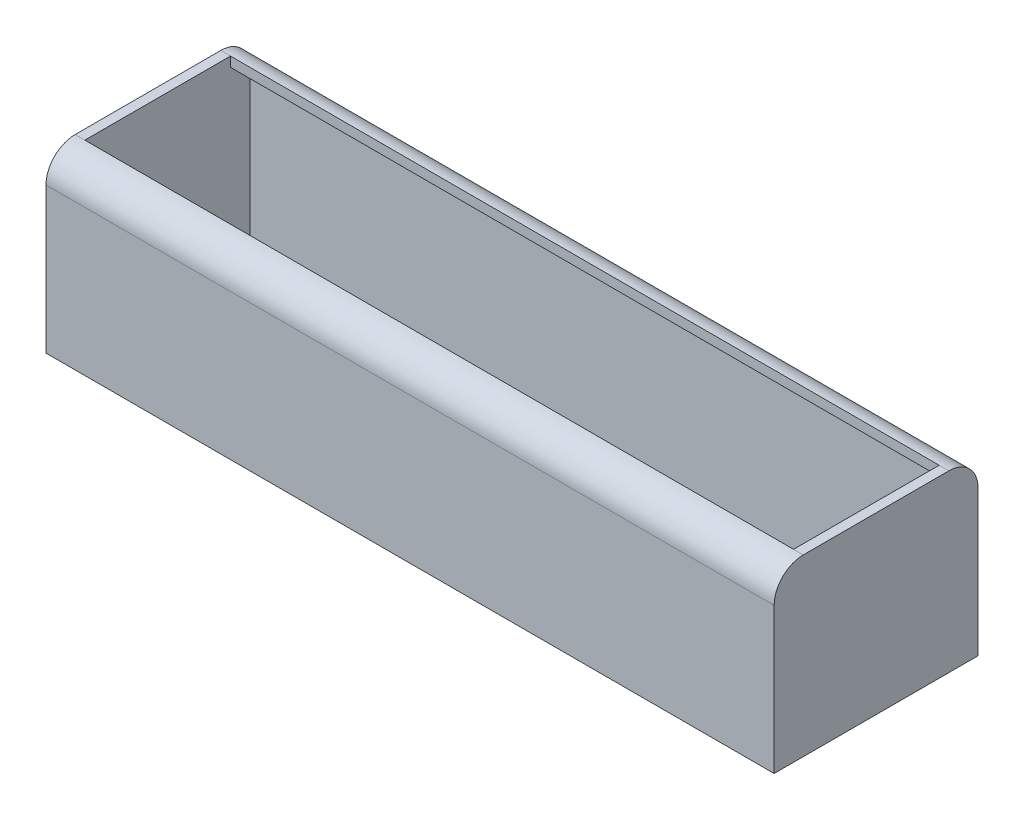
ISO-10303-21;
HEADER;
FILE_DESCRIPTION(('STEP AP214'),'2;1');
FILE_NAME('part.step','',(''),(''),'','','');
FILE_SCHEMA(('AUTOMOTIVE_DESIGN { 1 0 10303 214 1 1 1 1 }'));
ENDSEC;
DATA;
#1=APPLICATION_CONTEXT('core data for automotive mechanical design processes');
#2=APPLICATION_PROTOCOL_DEFINITION('international standard','automotive_design',2000,#1);
#3=PRODUCT_CONTEXT('',#1,'mechanical');
#4=PRODUCT('Part','Part','',(#3));
#5=PRODUCT_RELATED_PRODUCT_CATEGORY('part','',(#4));
#6=PRODUCT_DEFINITION_FORMATION('','',#4);
#7=PRODUCT_DEFINITION_CONTEXT('part definition',#1,'design');
#8=PRODUCT_DEFINITION('design','',#6,#7);
#9=PRODUCT_DEFINITION_SHAPE('','',#8);
#10=(LENGTH_UNIT() NAMED_UNIT(*) SI_UNIT(.MILLI.,.METRE.));
#11=(NAMED_UNIT(*) PLANE_ANGLE_UNIT() SI_UNIT($,.RADIAN.));
#12=(NAMED_UNIT(*) SI_UNIT($,.STERADIAN.) SOLID_ANGLE_UNIT());
#13=UNCERTAINTY_MEASURE_WITH_UNIT(LENGTH_MEASURE(1.E-05),#10,'distance_accuracy_value','');
#14=(GEOMETRIC_REPRESENTATION_CONTEXT(3) GLOBAL_UNCERTAINTY_ASSIGNED_CONTEXT((#13)) GLOBAL_UNIT_ASSIGNED_CONTEXT((#10,
#11,#12)) REPRESENTATION_CONTEXT('',''));
#15=CARTESIAN_POINT('',(0.,0.,0.));
#16=DIRECTION('',(0.,0.,1.));
#17=DIRECTION('',(1.,0.,0.));
#18=AXIS2_PLACEMENT_3D('',#15,#16,#17);
#19=CARTESIAN_POINT('',(75.,9.,7.49999999999998));
#20=DIRECTION('',(0.,-1.,0.));
#21=DIRECTION('',(0.,0.,-1.));
#22=AXIS2_PLACEMENT_3D('',#19,#20,#21);
#23=PLANE('',#22);
#24=DIRECTION('',(0.,0.,1.));
#25=VECTOR('',#24,1.);
#26=CARTESIAN_POINT('',(1.,9.,7.5));
#27=LINE('',#26,#25);
#28=CARTESIAN_POINT('',(1.,9.,-7.49999999999998));
#29=VERTEX_POINT('',#28);
#30=CARTESIAN_POINT('',(1.,9.,7.49999999999998));
#31=VERTEX_POINT('',#30);
#32=EDGE_CURVE('E164',#29,#31,#27,.T.);
#33=ORIENTED_EDGE('',*,*,#32,.F.);
#34=DIRECTION('',(-1.,0.,0.));
#35=VECTOR('',#34,1.);
#36=CARTESIAN_POINT('',(75.,9.,-7.49999999999998));
#37=LINE('',#36,#35);
#38=CARTESIAN_POINT('',(0.,9.,-7.49999999999998));
#39=VERTEX_POINT('',#38);
#40=EDGE_CURVE('E122',#29,#39,#37,.T.);
#41=ORIENTED_EDGE('',*,*,#40,.T.);
#42=DIRECTION('',(0.,0.,1.));
#43=VECTOR('',#42,1.);
#44=CARTESIAN_POINT('',(0.,9.,7.49999999999998));
#45=LINE('',#44,#43);
#46=CARTESIAN_POINT('',(0.,9.,7.49999999999998));
#47=VERTEX_POINT('',#46);
#48=EDGE_CURVE('E141',#39,#47,#45,.T.);
#49=ORIENTED_EDGE('',*,*,#48,.T.);
#50=DIRECTION('',(-1.,0.,0.));
#51=VECTOR('',#50,1.);
#52=CARTESIAN_POINT('',(75.,9.,7.49999999999998));
#53=LINE('',#52,#51);
#54=EDGE_CURVE('E147',#31,#47,#53,.T.);
#55=ORIENTED_EDGE('',*,*,#54,.F.);
#56=EDGE_LOOP('',(#33,#41,#49,#55));
#57=FACE_BOUND('',#56,.T.);
#58=ADVANCED_FACE('F32',(#57),#23,.F.);
#59=CARTESIAN_POINT('',(75.,-9.,10.5));
#60=DIRECTION('',(0.,0.,-1.));
#61=DIRECTION('',(-1.,0.,0.));
#62=AXIS2_PLACEMENT_3D('',#59,#60,#61);
#63=PLANE('',#62);
#64=DIRECTION('',(0.,-1.,0.));
#65=VECTOR('',#64,1.);
#66=CARTESIAN_POINT('',(0.,-9.,10.5));
#67=LINE('',#66,#65);
#68=CARTESIAN_POINT('',(0.,5.99999999999998,10.5));
#69=VERTEX_POINT('',#68);
#70=CARTESIAN_POINT('',(0.,-9.,10.5));
#71=VERTEX_POINT('',#70);
#72=EDGE_CURVE('E132',#69,#71,#67,.T.);
#73=ORIENTED_EDGE('',*,*,#72,.T.);
#74=DIRECTION('',(-1.,0.,0.));
#75=VECTOR('',#74,1.);
#76=CARTESIAN_POINT('',(75.,-9.,10.5));
#77=LINE('',#76,#75);
#78=CARTESIAN_POINT('',(75.,-9.,10.5));
#79=VERTEX_POINT('',#78);
#80=EDGE_CURVE('E11',#79,#71,#77,.T.);
#81=ORIENTED_EDGE('',*,*,#80,.F.);
#82=DIRECTION('',(0.,-1.,0.));
#83=VECTOR('',#82,1.);
#84=CARTESIAN_POINT('',(75.,-9.,10.5));
#85=LINE('',#84,#83);
#86=CARTESIAN_POINT('',(75.,5.99999999999998,10.5));
#87=VERTEX_POINT('',#86);
#88=EDGE_CURVE('E145',#87,#79,#85,.T.);
#89=ORIENTED_EDGE('',*,*,#88,.F.);
#90=DIRECTION('',(-1.,0.,0.));
#91=VECTOR('',#90,1.);
#92=CARTESIAN_POINT('',(75.,5.99999999999998,10.5));
#93=LINE('',#92,#91);
#94=EDGE_CURVE('E128',#87,#69,#93,.T.);
#95=ORIENTED_EDGE('',*,*,#94,.T.);
#96=EDGE_LOOP('',(#73,#81,#89,#95));
#97=FACE_BOUND('',#96,.T.);
#98=ADVANCED_FACE('F34',(#97),#63,.F.);
#99=CARTESIAN_POINT('',(75.,-9.,10.5));
#100=DIRECTION('',(0.,1.,0.));
#101=DIRECTION('',(0.,0.,1.));
#102=AXIS2_PLACEMENT_3D('',#99,#100,#101);
#103=PLANE('',#102);
#104=DIRECTION('',(0.,0.,-1.));
#105=VECTOR('',#104,1.);
#106=CARTESIAN_POINT('',(0.,-9.,10.5));
#107=LINE('',#106,#105);
#108=CARTESIAN_POINT('',(0.,-9.,-10.5));
#109=VERTEX_POINT('',#108);
#110=EDGE_CURVE('E135',#71,#109,#107,.T.);
#111=ORIENTED_EDGE('',*,*,#110,.T.);
#112=DIRECTION('',(-1.,0.,0.));
#113=VECTOR('',#112,1.);
#114=CARTESIAN_POINT('',(75.,-9.,-10.5));
#115=LINE('',#114,#113);
#116=CARTESIAN_POINT('',(75.,-9.,-10.5));
#117=VERTEX_POINT('',#116);
#118=EDGE_CURVE('E40',#117,#109,#115,.T.);
#119=ORIENTED_EDGE('',*,*,#118,.F.);
#120=DIRECTION('',(0.,0.,-1.));
#121=VECTOR('',#120,1.);
#122=CARTESIAN_POINT('',(75.,-9.,10.5));
#123=LINE('',#122,#121);
#124=EDGE_CURVE('E90',#79,#117,#123,.T.);
#125=ORIENTED_EDGE('',*,*,#124,.F.);
#126=ORIENTED_EDGE('',*,*,#80,.T.);
#127=EDGE_LOOP('',(#111,#119,#125,#126));
#128=FACE_BOUND('',#127,.T.);
#129=ADVANCED_FACE('F202',(#128),#103,.F.);
#130=CARTESIAN_POINT('',(75.,-9.,-10.5));
#131=DIRECTION('',(0.,0.,1.));
#132=DIRECTION('',(1.,0.,0.));
#133=AXIS2_PLACEMENT_3D('',#130,#131,#132);
#134=PLANE('',#133);
#135=DIRECTION('',(0.,1.,0.));
#136=VECTOR('',#135,1.);
#137=CARTESIAN_POINT('',(0.,-9.,-10.5));
#138=LINE('',#137,#136);
#139=CARTESIAN_POINT('',(0.,5.99999999999998,-10.5));
#140=VERTEX_POINT('',#139);
#141=EDGE_CURVE('E137',#109,#140,#138,.T.);
#142=ORIENTED_EDGE('',*,*,#141,.T.);
#143=DIRECTION('',(-1.,0.,0.));
#144=VECTOR('',#143,1.);
#145=CARTESIAN_POINT('',(75.,5.99999999999998,-10.5));
#146=LINE('',#145,#144);
#147=CARTESIAN_POINT('',(75.,5.99999999999998,-10.5));
#148=VERTEX_POINT('',#147);
#149=EDGE_CURVE('E121',#148,#140,#146,.T.);
#150=ORIENTED_EDGE('',*,*,#149,.F.);
#151=DIRECTION('',(0.,1.,0.));
#152=VECTOR('',#151,1.);
#153=CARTESIAN_POINT('',(75.,-9.,-10.5));
#154=LINE('',#153,#152);
#155=EDGE_CURVE('E107',#117,#148,#154,.T.);
#156=ORIENTED_EDGE('',*,*,#155,.F.);
#157=ORIENTED_EDGE('',*,*,#118,.T.);
#158=EDGE_LOOP('',(#142,#150,#156,#157));
#159=FACE_BOUND('',#158,.T.);
#160=ADVANCED_FACE('F152',(#159),#134,.F.);
#161=CARTESIAN_POINT('',(75.,6.,-7.5));
#162=DIRECTION('',(-1.,0.,0.));
#163=DIRECTION('',(0.,0.,1.));
#164=AXIS2_PLACEMENT_3D('',#161,#162,#163);
#165=CYLINDRICAL_SURFACE('',#164,3.);
#166=CARTESIAN_POINT('',(0.,6.,-7.5));
#167=DIRECTION('',(1.,0.,0.));
#168=DIRECTION('',(0.,0.,1.));
#169=AXIS2_PLACEMENT_3D('',#166,#167,#168);
#170=CIRCLE('',#169,3.);
#171=EDGE_CURVE('E139',#140,#39,#170,.T.);
#172=ORIENTED_EDGE('',*,*,#171,.T.);
#173=ORIENTED_EDGE('',*,*,#40,.F.);
#174=DIRECTION('',(-1.,0.,0.));
#175=VECTOR('',#174,1.);
#176=CARTESIAN_POINT('',(75.,9.,-7.49999999999998));
#177=LINE('',#176,#175);
#178=CARTESIAN_POINT('',(74.,9.,-7.49999999999998));
#179=VERTEX_POINT('',#178);
#180=EDGE_CURVE('E118',#179,#29,#177,.T.);
#181=ORIENTED_EDGE('',*,*,#180,.F.);
#182=CARTESIAN_POINT('',(75.,9.,-7.49999999999998));
#183=VERTEX_POINT('',#182);
#184=EDGE_CURVE('E114',#183,#179,#37,.T.);
#185=ORIENTED_EDGE('',*,*,#184,.F.);
#186=CARTESIAN_POINT('',(75.,6.,-7.5));
#187=DIRECTION('',(1.,0.,0.));
#188=DIRECTION('',(0.,0.,1.));
#189=AXIS2_PLACEMENT_3D('',#186,#187,#188);
#190=CIRCLE('',#189,3.);
#191=EDGE_CURVE('E100',#148,#183,#190,.T.);
#192=ORIENTED_EDGE('',*,*,#191,.F.);
#193=ORIENTED_EDGE('',*,*,#149,.T.);
#194=EDGE_LOOP('',(#172,#173,#181,#185,#192,#193));
#195=FACE_BOUND('',#194,.T.);
#196=ADVANCED_FACE('F116',(#195),#165,.T.);
#197=ORIENTED_EDGE('',*,*,#184,.T.);
#198=DIRECTION('',(0.,0.,1.));
#199=VECTOR('',#198,1.);
#200=CARTESIAN_POINT('',(74.,9.,7.5));
#201=LINE('',#200,#199);
#202=CARTESIAN_POINT('',(74.,9.,7.49999999999998));
#203=VERTEX_POINT('',#202);
#204=EDGE_CURVE('E191',#179,#203,#201,.T.);
#205=ORIENTED_EDGE('',*,*,#204,.T.);
#206=CARTESIAN_POINT('',(75.,9.,7.49999999999998));
#207=VERTEX_POINT('',#206);
#208=EDGE_CURVE('E126',#207,#203,#53,.T.);
#209=ORIENTED_EDGE('',*,*,#208,.F.);
#210=DIRECTION('',(0.,0.,1.));
#211=VECTOR('',#210,1.);
#212=CARTESIAN_POINT('',(75.,9.,7.49999999999998));
#213=LINE('',#212,#211);
#214=EDGE_CURVE('E104',#183,#207,#213,.T.);
#215=ORIENTED_EDGE('',*,*,#214,.F.);
#216=EDGE_LOOP('',(#197,#205,#209,#215));
#217=FACE_BOUND('',#216,.T.);
#218=ADVANCED_FACE('F124',(#217),#23,.F.);
#219=CARTESIAN_POINT('',(75.,6.,7.5));
#220=DIRECTION('',(-1.,0.,0.));
#221=DIRECTION('',(0.,0.,1.));
#222=AXIS2_PLACEMENT_3D('',#219,#220,#221);
#223=CYLINDRICAL_SURFACE('',#222,3.);
#224=CARTESIAN_POINT('',(0.,6.,7.5));
#225=DIRECTION('',(1.,0.,0.));
#226=DIRECTION('',(0.,0.,1.));
#227=AXIS2_PLACEMENT_3D('',#224,#225,#226);
#228=CIRCLE('',#227,3.);
#229=EDGE_CURVE('E82',#47,#69,#228,.T.);
#230=ORIENTED_EDGE('',*,*,#229,.T.);
#231=ORIENTED_EDGE('',*,*,#94,.F.);
#232=CARTESIAN_POINT('',(75.,6.,7.5));
#233=DIRECTION('',(1.,0.,0.));
#234=DIRECTION('',(0.,0.,1.));
#235=AXIS2_PLACEMENT_3D('',#232,#233,#234);
#236=CIRCLE('',#235,3.);
#237=EDGE_CURVE('E56',#207,#87,#236,.T.);
#238=ORIENTED_EDGE('',*,*,#237,.F.);
#239=ORIENTED_EDGE('',*,*,#208,.T.);
#240=DIRECTION('',(-1.,0.,0.));
#241=VECTOR('',#240,1.);
#242=CARTESIAN_POINT('',(75.,9.,7.49999999999998));
#243=LINE('',#242,#241);
#244=EDGE_CURVE('E347',#203,#31,#243,.T.);
#245=ORIENTED_EDGE('',*,*,#244,.T.);
#246=ORIENTED_EDGE('',*,*,#54,.T.);
#247=EDGE_LOOP('',(#230,#231,#238,#239,#245,#246));
#248=FACE_BOUND('',#247,.T.);
#249=ADVANCED_FACE('F216',(#248),#223,.T.);
#250=CARTESIAN_POINT('',(75.,6.,7.5));
#251=DIRECTION('',(-1.,0.,0.));
#252=DIRECTION('',(0.,0.,1.));
#253=AXIS2_PLACEMENT_3D('',#250,#251,#252);
#254=PLANE('',#253);
#255=ORIENTED_EDGE('',*,*,#88,.T.);
#256=ORIENTED_EDGE('',*,*,#124,.T.);
#257=ORIENTED_EDGE('',*,*,#155,.T.);
#258=ORIENTED_EDGE('',*,*,#191,.T.);
#259=ORIENTED_EDGE('',*,*,#214,.T.);
#260=ORIENTED_EDGE('',*,*,#237,.T.);
#261=EDGE_LOOP('',(#255,#256,#257,#258,#259,#260));
#262=FACE_BOUND('',#261,.T.);
#263=ADVANCED_FACE('F102',(#262),#254,.F.);
#264=CARTESIAN_POINT('',(0.,6.,7.5));
#265=DIRECTION('',(-1.,0.,0.));
#266=DIRECTION('',(0.,0.,1.));
#267=AXIS2_PLACEMENT_3D('',#264,#265,#266);
#268=PLANE('',#267);
#269=ORIENTED_EDGE('',*,*,#72,.F.);
#270=ORIENTED_EDGE('',*,*,#229,.F.);
#271=ORIENTED_EDGE('',*,*,#48,.F.);
#272=ORIENTED_EDGE('',*,*,#171,.F.);
#273=ORIENTED_EDGE('',*,*,#141,.F.);
#274=ORIENTED_EDGE('',*,*,#110,.F.);
#275=EDGE_LOOP('',(#269,#270,#271,#272,#273,#274));
#276=FACE_BOUND('',#275,.T.);
#277=ADVANCED_FACE('F156',(#276),#268,.T.);
#278=CARTESIAN_POINT('',(75.,9.,-7.49999999999998));
#279=DIRECTION('',(0.,0.,1.));
#280=DIRECTION('',(-1.,0.,0.));
#281=AXIS2_PLACEMENT_3D('',#278,#279,#280);
#282=PLANE('',#281);
#283=ORIENTED_EDGE('',*,*,#180,.T.);
#284=DIRECTION('',(0.,-1.,0.));
#285=VECTOR('',#284,1.);
#286=CARTESIAN_POINT('',(1.,9.,-7.49999999999998));
#287=LINE('',#286,#285);
#288=CARTESIAN_POINT('',(1.,8.,-7.49999999999998));
#289=VERTEX_POINT('',#288);
#290=EDGE_CURVE('E181',#289,#29,#287,.F.);
#291=ORIENTED_EDGE('',*,*,#290,.F.);
#292=DIRECTION('',(-1.,0.,0.));
#293=VECTOR('',#292,1.);
#294=CARTESIAN_POINT('',(37.5,8.,-7.49999999999998));
#295=LINE('',#294,#293);
#296=CARTESIAN_POINT('',(74.,8.,-7.49999999999998));
#297=VERTEX_POINT('',#296);
#298=EDGE_CURVE('E189',#297,#289,#295,.T.);
#299=ORIENTED_EDGE('',*,*,#298,.F.);
#300=DIRECTION('',(0.,-1.,0.));
#301=VECTOR('',#300,1.);
#302=CARTESIAN_POINT('',(74.,9.,-7.49999999999998));
#303=LINE('',#302,#301);
#304=EDGE_CURVE('E47',#297,#179,#303,.F.);
#305=ORIENTED_EDGE('',*,*,#304,.T.);
#306=EDGE_LOOP('',(#283,#291,#299,#305));
#307=FACE_BOUND('',#306,.T.);
#308=ADVANCED_FACE('F247',(#307),#282,.T.);
#309=CARTESIAN_POINT('',(75.,9.,7.49999999999998));
#310=DIRECTION('',(0.,0.,1.));
#311=DIRECTION('',(-1.,0.,0.));
#312=AXIS2_PLACEMENT_3D('',#309,#310,#311);
#313=PLANE('',#312);
#314=ORIENTED_EDGE('',*,*,#244,.F.);
#315=DIRECTION('',(0.,-1.,0.));
#316=VECTOR('',#315,1.);
#317=CARTESIAN_POINT('',(74.,9.,7.49999999999998));
#318=LINE('',#317,#316);
#319=CARTESIAN_POINT('',(74.,8.,7.49999999999998));
#320=VERTEX_POINT('',#319);
#321=EDGE_CURVE('E185',#320,#203,#318,.F.);
#322=ORIENTED_EDGE('',*,*,#321,.F.);
#323=DIRECTION('',(-1.,0.,0.));
#324=VECTOR('',#323,1.);
#325=CARTESIAN_POINT('',(37.5,8.,7.49999999999998));
#326=LINE('',#325,#324);
#327=CARTESIAN_POINT('',(1.,8.,7.49999999999998));
#328=VERTEX_POINT('',#327);
#329=EDGE_CURVE('E186',#320,#328,#326,.T.);
#330=ORIENTED_EDGE('',*,*,#329,.T.);
#331=DIRECTION('',(0.,1.,0.));
#332=VECTOR('',#331,1.);
#333=CARTESIAN_POINT('',(1.,6.,7.49999999999998));
#334=LINE('',#333,#332);
#335=EDGE_CURVE('E183',#328,#31,#334,.T.);
#336=ORIENTED_EDGE('',*,*,#335,.T.);
#337=EDGE_LOOP('',(#314,#322,#330,#336));
#338=FACE_BOUND('',#337,.T.);
#339=ADVANCED_FACE('F265',(#338),#313,.F.);
#340=CARTESIAN_POINT('',(75.,-9.,9.5));
#341=DIRECTION('',(0.,0.,-1.));
#342=DIRECTION('',(-1.,0.,0.));
#343=AXIS2_PLACEMENT_3D('',#340,#341,#342);
#344=PLANE('',#343);
#345=DIRECTION('',(0.,-1.,0.));
#346=VECTOR('',#345,1.);
#347=CARTESIAN_POINT('',(1.,6.,9.5));
#348=LINE('',#347,#346);
#349=CARTESIAN_POINT('',(1.,5.99999999999998,9.5));
#350=VERTEX_POINT('',#349);
#351=CARTESIAN_POINT('',(1.,-8.,9.5));
#352=VERTEX_POINT('',#351);
#353=EDGE_CURVE('E403',#350,#352,#348,.T.);
#354=ORIENTED_EDGE('',*,*,#353,.F.);
#355=DIRECTION('',(-1.,0.,0.));
#356=VECTOR('',#355,1.);
#357=CARTESIAN_POINT('',(75.,5.99999999999998,9.5));
#358=LINE('',#357,#356);
#359=CARTESIAN_POINT('',(74.,5.99999999999998,9.5));
#360=VERTEX_POINT('',#359);
#361=EDGE_CURVE('E351',#360,#350,#358,.T.);
#362=ORIENTED_EDGE('',*,*,#361,.F.);
#363=DIRECTION('',(0.,-1.,0.));
#364=VECTOR('',#363,1.);
#365=CARTESIAN_POINT('',(74.,6.,9.5));
#366=LINE('',#365,#364);
#367=CARTESIAN_POINT('',(74.,-8.,9.5));
#368=VERTEX_POINT('',#367);
#369=EDGE_CURVE('E174',#360,#368,#366,.T.);
#370=ORIENTED_EDGE('',*,*,#369,.T.);
#371=DIRECTION('',(-1.,0.,0.));
#372=VECTOR('',#371,1.);
#373=CARTESIAN_POINT('',(75.,-8.,9.5));
#374=LINE('',#373,#372);
#375=EDGE_CURVE('E190',#368,#352,#374,.T.);
#376=ORIENTED_EDGE('',*,*,#375,.T.);
#377=EDGE_LOOP('',(#354,#362,#370,#376));
#378=FACE_BOUND('',#377,.T.);
#379=ADVANCED_FACE('F258',(#378),#344,.T.);
#380=CARTESIAN_POINT('',(75.,-8.,10.5));
#381=DIRECTION('',(0.,1.,0.));
#382=DIRECTION('',(0.,0.,1.));
#383=AXIS2_PLACEMENT_3D('',#380,#381,#382);
#384=PLANE('',#383);
#385=DIRECTION('',(0.,0.,-1.));
#386=VECTOR('',#385,1.);
#387=CARTESIAN_POINT('',(1.,-8.,7.5));
#388=LINE('',#387,#386);
#389=CARTESIAN_POINT('',(1.,-8.,-9.5));
#390=VERTEX_POINT('',#389);
#391=EDGE_CURVE('E381',#352,#390,#388,.T.);
#392=ORIENTED_EDGE('',*,*,#391,.F.);
#393=ORIENTED_EDGE('',*,*,#375,.F.);
#394=DIRECTION('',(0.,0.,-1.));
#395=VECTOR('',#394,1.);
#396=CARTESIAN_POINT('',(74.,-8.,7.5));
#397=LINE('',#396,#395);
#398=CARTESIAN_POINT('',(74.,-8.,-9.5));
#399=VERTEX_POINT('',#398);
#400=EDGE_CURVE('E397',#368,#399,#397,.T.);
#401=ORIENTED_EDGE('',*,*,#400,.T.);
#402=DIRECTION('',(-1.,0.,0.));
#403=VECTOR('',#402,1.);
#404=CARTESIAN_POINT('',(75.,-8.,-9.5));
#405=LINE('',#404,#403);
#406=EDGE_CURVE('E391',#399,#390,#405,.T.);
#407=ORIENTED_EDGE('',*,*,#406,.T.);
#408=EDGE_LOOP('',(#392,#393,#401,#407));
#409=FACE_BOUND('',#408,.T.);
#410=ADVANCED_FACE('F264',(#409),#384,.T.);
#411=CARTESIAN_POINT('',(75.,-9.,-9.5));
#412=DIRECTION('',(0.,0.,1.));
#413=DIRECTION('',(1.,0.,0.));
#414=AXIS2_PLACEMENT_3D('',#411,#412,#413);
#415=PLANE('',#414);
#416=DIRECTION('',(0.,1.,0.));
#417=VECTOR('',#416,1.);
#418=CARTESIAN_POINT('',(1.,6.,-9.5));
#419=LINE('',#418,#417);
#420=CARTESIAN_POINT('',(1.,5.99999999999999,-9.5));
#421=VERTEX_POINT('',#420);
#422=EDGE_CURVE('E177',#390,#421,#419,.T.);
#423=ORIENTED_EDGE('',*,*,#422,.F.);
#424=ORIENTED_EDGE('',*,*,#406,.F.);
#425=DIRECTION('',(0.,1.,0.));
#426=VECTOR('',#425,1.);
#427=CARTESIAN_POINT('',(74.,6.,-9.5));
#428=LINE('',#427,#426);
#429=CARTESIAN_POINT('',(74.,5.99999999999999,-9.5));
#430=VERTEX_POINT('',#429);
#431=EDGE_CURVE('E390',#399,#430,#428,.T.);
#432=ORIENTED_EDGE('',*,*,#431,.T.);
#433=DIRECTION('',(-1.,0.,0.));
#434=VECTOR('',#433,1.);
#435=CARTESIAN_POINT('',(75.,5.99999999999999,-9.5));
#436=LINE('',#435,#434);
#437=EDGE_CURVE('E387',#430,#421,#436,.T.);
#438=ORIENTED_EDGE('',*,*,#437,.T.);
#439=EDGE_LOOP('',(#423,#424,#432,#438));
#440=FACE_BOUND('',#439,.T.);
#441=ADVANCED_FACE('F275',(#440),#415,.T.);
#442=CARTESIAN_POINT('',(75.,6.,-7.5));
#443=DIRECTION('',(-1.,0.,0.));
#444=DIRECTION('',(0.,0.,1.));
#445=AXIS2_PLACEMENT_3D('',#442,#443,#444);
#446=CYLINDRICAL_SURFACE('',#445,2.);
#447=CARTESIAN_POINT('',(1.,6.,-7.5));
#448=DIRECTION('',(-1.,0.,0.));
#449=DIRECTION('',(0.,0.,1.));
#450=AXIS2_PLACEMENT_3D('',#447,#448,#449);
#451=CIRCLE('',#450,2.);
#452=EDGE_CURVE('E171',#421,#289,#451,.F.);
#453=ORIENTED_EDGE('',*,*,#452,.F.);
#454=ORIENTED_EDGE('',*,*,#437,.F.);
#455=CARTESIAN_POINT('',(74.,6.,-7.5));
#456=DIRECTION('',(-1.,0.,0.));
#457=DIRECTION('',(0.,0.,1.));
#458=AXIS2_PLACEMENT_3D('',#455,#456,#457);
#459=CIRCLE('',#458,2.);
#460=EDGE_CURVE('E194',#430,#297,#459,.F.);
#461=ORIENTED_EDGE('',*,*,#460,.T.);
#462=ORIENTED_EDGE('',*,*,#298,.T.);
#463=EDGE_LOOP('',(#453,#454,#461,#462));
#464=FACE_BOUND('',#463,.T.);
#465=ADVANCED_FACE('F284',(#464),#446,.F.);
#466=CARTESIAN_POINT('',(75.,6.,7.5));
#467=DIRECTION('',(-1.,0.,0.));
#468=DIRECTION('',(0.,0.,1.));
#469=AXIS2_PLACEMENT_3D('',#466,#467,#468);
#470=CYLINDRICAL_SURFACE('',#469,2.);
#471=CARTESIAN_POINT('',(1.,6.,7.5));
#472=DIRECTION('',(-1.,0.,0.));
#473=DIRECTION('',(0.,0.,1.));
#474=AXIS2_PLACEMENT_3D('',#471,#472,#473);
#475=CIRCLE('',#474,2.);
#476=EDGE_CURVE('E170',#328,#350,#475,.F.);
#477=ORIENTED_EDGE('',*,*,#476,.F.);
#478=ORIENTED_EDGE('',*,*,#329,.F.);
#479=CARTESIAN_POINT('',(74.,6.,7.5));
#480=DIRECTION('',(-1.,0.,0.));
#481=DIRECTION('',(0.,0.,1.));
#482=AXIS2_PLACEMENT_3D('',#479,#480,#481);
#483=CIRCLE('',#482,2.);
#484=EDGE_CURVE('E193',#320,#360,#483,.F.);
#485=ORIENTED_EDGE('',*,*,#484,.T.);
#486=ORIENTED_EDGE('',*,*,#361,.T.);
#487=EDGE_LOOP('',(#477,#478,#485,#486));
#488=FACE_BOUND('',#487,.T.);
#489=ADVANCED_FACE('F293',(#488),#470,.F.);
#490=CARTESIAN_POINT('',(74.,6.,7.5));
#491=DIRECTION('',(-1.,0.,0.));
#492=DIRECTION('',(0.,0.,1.));
#493=AXIS2_PLACEMENT_3D('',#490,#491,#492);
#494=PLANE('',#493);
#495=ORIENTED_EDGE('',*,*,#369,.F.);
#496=ORIENTED_EDGE('',*,*,#484,.F.);
#497=ORIENTED_EDGE('',*,*,#321,.T.);
#498=ORIENTED_EDGE('',*,*,#204,.F.);
#499=ORIENTED_EDGE('',*,*,#304,.F.);
#500=ORIENTED_EDGE('',*,*,#460,.F.);
#501=ORIENTED_EDGE('',*,*,#431,.F.);
#502=ORIENTED_EDGE('',*,*,#400,.F.);
#503=EDGE_LOOP('',(#495,#496,#497,#498,#499,#500,#501,#502));
#504=FACE_BOUND('',#503,.T.);
#505=ADVANCED_FACE('F302',(#504),#494,.T.);
#506=CARTESIAN_POINT('',(1.,6.,7.5));
#507=DIRECTION('',(-1.,0.,0.));
#508=DIRECTION('',(0.,0.,1.));
#509=AXIS2_PLACEMENT_3D('',#506,#507,#508);
#510=PLANE('',#509);
#511=ORIENTED_EDGE('',*,*,#353,.T.);
#512=ORIENTED_EDGE('',*,*,#391,.T.);
#513=ORIENTED_EDGE('',*,*,#422,.T.);
#514=ORIENTED_EDGE('',*,*,#452,.T.);
#515=ORIENTED_EDGE('',*,*,#290,.T.);
#516=ORIENTED_EDGE('',*,*,#32,.T.);
#517=ORIENTED_EDGE('',*,*,#335,.F.);
#518=ORIENTED_EDGE('',*,*,#476,.T.);
#519=EDGE_LOOP('',(#511,#512,#513,#514,#515,#516,#517,#518));
#520=FACE_BOUND('',#519,.T.);
#521=ADVANCED_FACE('F311',(#520),#510,.F.);
#522=CLOSED_SHELL('',(#58,#98,#129,#160,#196,#218,#249,#263,#277,#308,#339,#379,#410,#441,#465,
#489,#505,#521));
#523=MANIFOLD_SOLID_BREP('B2',#522);
#524=ADVANCED_BREP_SHAPE_REPRESENTATION('',(#18,#523),#14);
#525=SHAPE_DEFINITION_REPRESENTATION(#9,#524);
ENDSEC;
END-ISO-10303-21;
